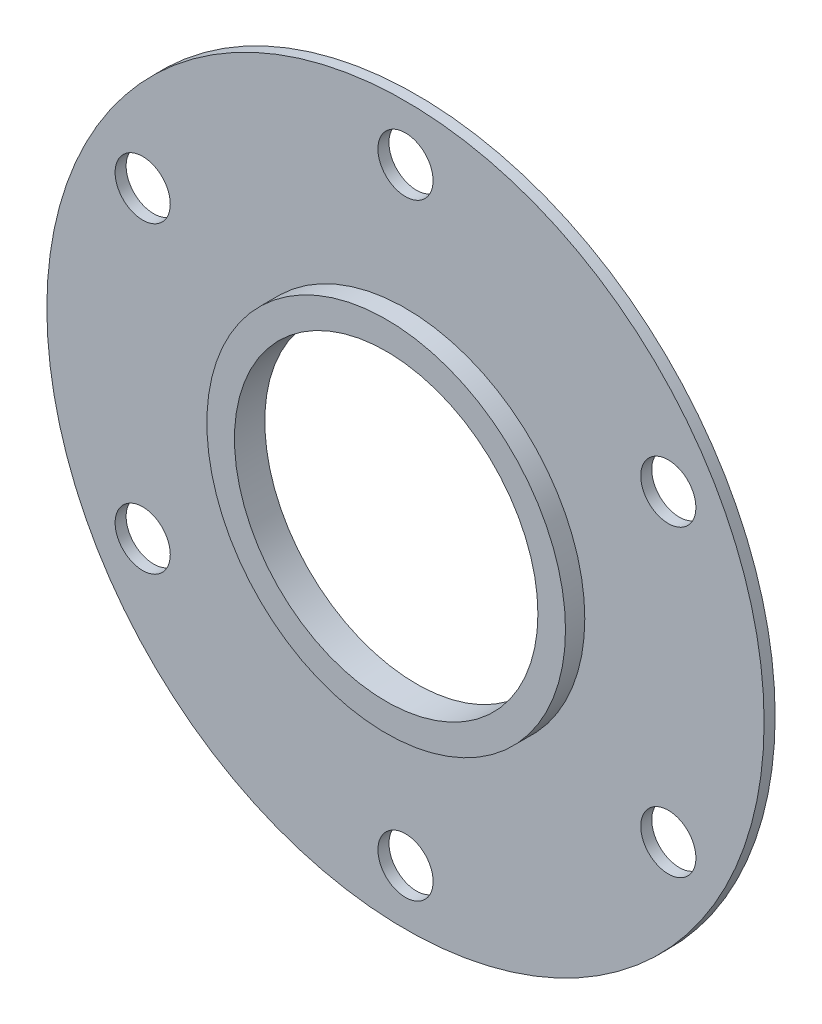
ISO-10303-21;
HEADER;
FILE_DESCRIPTION(('STEP AP214'),'2;1');
FILE_NAME('part.step','',(''),(''),'','','');
FILE_SCHEMA(('AUTOMOTIVE_DESIGN { 1 0 10303 214 1 1 1 1 }'));
ENDSEC;
DATA;
#1=APPLICATION_CONTEXT('core data for automotive mechanical design processes');
#2=APPLICATION_PROTOCOL_DEFINITION('international standard','automotive_design',2000,#1);
#3=PRODUCT_CONTEXT('',#1,'mechanical');
#4=PRODUCT('Part','Part','',(#3));
#5=PRODUCT_RELATED_PRODUCT_CATEGORY('part','',(#4));
#6=PRODUCT_DEFINITION_FORMATION('','',#4);
#7=PRODUCT_DEFINITION_CONTEXT('part definition',#1,'design');
#8=PRODUCT_DEFINITION('design','',#6,#7);
#9=PRODUCT_DEFINITION_SHAPE('','',#8);
#10=(LENGTH_UNIT() NAMED_UNIT(*) SI_UNIT(.MILLI.,.METRE.));
#11=(NAMED_UNIT(*) PLANE_ANGLE_UNIT() SI_UNIT($,.RADIAN.));
#12=(NAMED_UNIT(*) SI_UNIT($,.STERADIAN.) SOLID_ANGLE_UNIT());
#13=UNCERTAINTY_MEASURE_WITH_UNIT(LENGTH_MEASURE(1.E-05),#10,'distance_accuracy_value','');
#14=(GEOMETRIC_REPRESENTATION_CONTEXT(3) GLOBAL_UNCERTAINTY_ASSIGNED_CONTEXT((#13)) GLOBAL_UNIT_ASSIGNED_CONTEXT((#10,
#11,#12)) REPRESENTATION_CONTEXT('',''));
#15=CARTESIAN_POINT('',(0.,0.,0.));
#16=DIRECTION('',(0.,0.,1.));
#17=DIRECTION('',(1.,0.,0.));
#18=AXIS2_PLACEMENT_3D('',#15,#16,#17);
#19=CARTESIAN_POINT('',(0.,0.,0.8));
#20=DIRECTION('',(0.,0.,1.));
#21=DIRECTION('',(1.,0.,0.));
#22=AXIS2_PLACEMENT_3D('',#19,#20,#21);
#23=PLANE('',#22);
#24=CARTESIAN_POINT('',(-19.0520588832566,10.9991339745948,0.8));
#25=DIRECTION('',(0.,0.,1.));
#26=DIRECTION('',(1.,0.,0.));
#27=AXIS2_PLACEMENT_3D('',#24,#25,#26);
#28=CIRCLE('',#27,2.);
#29=CARTESIAN_POINT('',(-17.0520588832566,10.9991339745948,0.8));
#30=VERTEX_POINT('',#29);
#31=EDGE_CURVE('E76',#30,#30,#28,.T.);
#32=ORIENTED_EDGE('',*,*,#31,.F.);
#33=EDGE_LOOP('',(#32));
#34=FACE_BOUND('',#33,.T.);
#35=CARTESIAN_POINT('',(0.00200000000360557,-22.,0.8));
#36=DIRECTION('',(0.,0.,1.));
#37=DIRECTION('',(1.,0.,0.));
#38=AXIS2_PLACEMENT_3D('',#35,#36,#37);
#39=CIRCLE('',#38,2.);
#40=CARTESIAN_POINT('',(2.00200000000361,-22.,0.8));
#41=VERTEX_POINT('',#40);
#42=EDGE_CURVE('E64',#41,#41,#39,.T.);
#43=ORIENTED_EDGE('',*,*,#42,.F.);
#44=EDGE_LOOP('',(#43));
#45=FACE_BOUND('',#44,.T.);
#46=CARTESIAN_POINT('',(19.0530588832586,11.0008660254054,0.8));
#47=DIRECTION('',(0.,0.,1.));
#48=DIRECTION('',(1.,0.,0.));
#49=AXIS2_PLACEMENT_3D('',#46,#47,#48);
#50=CIRCLE('',#49,2.);
#51=CARTESIAN_POINT('',(21.0530588832586,11.0008660254054,0.8));
#52=VERTEX_POINT('',#51);
#53=EDGE_CURVE('E52',#52,#52,#50,.T.);
#54=ORIENTED_EDGE('',*,*,#53,.F.);
#55=EDGE_LOOP('',(#54));
#56=FACE_BOUND('',#55,.T.);
#57=CARTESIAN_POINT('',(0.,0.,0.8));
#58=DIRECTION('',(0.,0.,1.));
#59=DIRECTION('',(1.,0.,0.));
#60=AXIS2_PLACEMENT_3D('',#57,#58,#59);
#61=CIRCLE('',#60,26.);
#62=CARTESIAN_POINT('',(26.,0.,0.8));
#63=VERTEX_POINT('',#62);
#64=EDGE_CURVE('E10',#63,#63,#61,.T.);
#65=ORIENTED_EDGE('',*,*,#64,.T.);
#66=EDGE_LOOP('',(#65));
#67=FACE_BOUND('',#66,.T.);
#68=CARTESIAN_POINT('',(0.,22.,0.8));
#69=DIRECTION('',(0.,0.,1.));
#70=DIRECTION('',(1.,0.,0.));
#71=AXIS2_PLACEMENT_3D('',#68,#69,#70);
#72=CIRCLE('',#71,2.);
#73=CARTESIAN_POINT('',(2.,22.,0.8));
#74=VERTEX_POINT('',#73);
#75=EDGE_CURVE('E48',#74,#74,#72,.T.);
#76=ORIENTED_EDGE('',*,*,#75,.F.);
#77=EDGE_LOOP('',(#76));
#78=FACE_BOUND('',#77,.T.);
#79=CARTESIAN_POINT('',(19.0540588832604,-10.9991339745947,0.8));
#80=DIRECTION('',(0.,0.,1.));
#81=DIRECTION('',(1.,0.,0.));
#82=AXIS2_PLACEMENT_3D('',#79,#80,#81);
#83=CIRCLE('',#82,2.);
#84=CARTESIAN_POINT('',(21.0540588832604,-10.9991339745947,0.8));
#85=VERTEX_POINT('',#84);
#86=EDGE_CURVE('E58',#85,#85,#83,.T.);
#87=ORIENTED_EDGE('',*,*,#86,.F.);
#88=EDGE_LOOP('',(#87));
#89=FACE_BOUND('',#88,.T.);
#90=CARTESIAN_POINT('',(-19.0510588832549,-11.0008660254052,0.8));
#91=DIRECTION('',(0.,0.,1.));
#92=DIRECTION('',(1.,0.,0.));
#93=AXIS2_PLACEMENT_3D('',#90,#91,#92);
#94=CIRCLE('',#93,2.);
#95=CARTESIAN_POINT('',(-17.0510588832549,-11.0008660254052,0.8));
#96=VERTEX_POINT('',#95);
#97=EDGE_CURVE('E70',#96,#96,#94,.T.);
#98=ORIENTED_EDGE('',*,*,#97,.F.);
#99=EDGE_LOOP('',(#98));
#100=FACE_BOUND('',#99,.T.);
#101=CARTESIAN_POINT('',(0.,0.,0.8));
#102=DIRECTION('',(0.,0.,1.));
#103=DIRECTION('',(1.,0.,0.));
#104=AXIS2_PLACEMENT_3D('',#101,#102,#103);
#105=CIRCLE('',#104,13.);
#106=CARTESIAN_POINT('',(13.,0.,0.8));
#107=VERTEX_POINT('',#106);
#108=EDGE_CURVE('E85',#107,#107,#105,.T.);
#109=ORIENTED_EDGE('',*,*,#108,.F.);
#110=EDGE_LOOP('',(#109));
#111=FACE_BOUND('',#110,.T.);
#112=ADVANCED_FACE('F33',(#34,#45,#56,#67,#78,#89,#100,#111),#23,.T.);
#113=CARTESIAN_POINT('',(0.,0.,0.));
#114=DIRECTION('',(0.,0.,1.));
#115=DIRECTION('',(1.,0.,0.));
#116=AXIS2_PLACEMENT_3D('',#113,#114,#115);
#117=PLANE('',#116);
#118=CARTESIAN_POINT('',(0.,0.,0.));
#119=DIRECTION('',(0.,0.,1.));
#120=DIRECTION('',(1.,0.,0.));
#121=AXIS2_PLACEMENT_3D('',#118,#119,#120);
#122=CIRCLE('',#121,26.);
#123=CARTESIAN_POINT('',(26.,0.,0.));
#124=VERTEX_POINT('',#123);
#125=EDGE_CURVE('E37',#124,#124,#122,.T.);
#126=ORIENTED_EDGE('',*,*,#125,.F.);
#127=EDGE_LOOP('',(#126));
#128=FACE_BOUND('',#127,.T.);
#129=CARTESIAN_POINT('',(0.,0.,0.));
#130=DIRECTION('',(0.,0.,1.));
#131=DIRECTION('',(1.,0.,0.));
#132=AXIS2_PLACEMENT_3D('',#129,#130,#131);
#133=CIRCLE('',#132,11.);
#134=CARTESIAN_POINT('',(11.,0.,0.));
#135=VERTEX_POINT('',#134);
#136=EDGE_CURVE('E44',#135,#135,#133,.T.);
#137=ORIENTED_EDGE('',*,*,#136,.T.);
#138=EDGE_LOOP('',(#137));
#139=FACE_BOUND('',#138,.T.);
#140=CARTESIAN_POINT('',(0.,22.,0.));
#141=DIRECTION('',(0.,0.,1.));
#142=DIRECTION('',(1.,0.,0.));
#143=AXIS2_PLACEMENT_3D('',#140,#141,#142);
#144=CIRCLE('',#143,2.);
#145=CARTESIAN_POINT('',(2.,22.,0.));
#146=VERTEX_POINT('',#145);
#147=EDGE_CURVE('E49',#146,#146,#144,.T.);
#148=ORIENTED_EDGE('',*,*,#147,.T.);
#149=EDGE_LOOP('',(#148));
#150=FACE_BOUND('',#149,.T.);
#151=CARTESIAN_POINT('',(19.0530588832586,11.0008660254054,0.));
#152=DIRECTION('',(0.,0.,1.));
#153=DIRECTION('',(1.,0.,0.));
#154=AXIS2_PLACEMENT_3D('',#151,#152,#153);
#155=CIRCLE('',#154,2.);
#156=CARTESIAN_POINT('',(21.0530588832586,11.0008660254054,0.));
#157=VERTEX_POINT('',#156);
#158=EDGE_CURVE('E55',#157,#157,#155,.T.);
#159=ORIENTED_EDGE('',*,*,#158,.T.);
#160=EDGE_LOOP('',(#159));
#161=FACE_BOUND('',#160,.T.);
#162=CARTESIAN_POINT('',(19.0540588832604,-10.9991339745947,0.));
#163=DIRECTION('',(0.,0.,1.));
#164=DIRECTION('',(1.,0.,0.));
#165=AXIS2_PLACEMENT_3D('',#162,#163,#164);
#166=CIRCLE('',#165,2.);
#167=CARTESIAN_POINT('',(21.0540588832604,-10.9991339745947,0.));
#168=VERTEX_POINT('',#167);
#169=EDGE_CURVE('E61',#168,#168,#166,.T.);
#170=ORIENTED_EDGE('',*,*,#169,.T.);
#171=EDGE_LOOP('',(#170));
#172=FACE_BOUND('',#171,.T.);
#173=CARTESIAN_POINT('',(0.00200000000360557,-22.,0.));
#174=DIRECTION('',(0.,0.,1.));
#175=DIRECTION('',(1.,0.,0.));
#176=AXIS2_PLACEMENT_3D('',#173,#174,#175);
#177=CIRCLE('',#176,2.);
#178=CARTESIAN_POINT('',(2.00200000000361,-22.,0.));
#179=VERTEX_POINT('',#178);
#180=EDGE_CURVE('E67',#179,#179,#177,.T.);
#181=ORIENTED_EDGE('',*,*,#180,.T.);
#182=EDGE_LOOP('',(#181));
#183=FACE_BOUND('',#182,.T.);
#184=CARTESIAN_POINT('',(-19.0510588832549,-11.0008660254052,0.));
#185=DIRECTION('',(0.,0.,1.));
#186=DIRECTION('',(1.,0.,0.));
#187=AXIS2_PLACEMENT_3D('',#184,#185,#186);
#188=CIRCLE('',#187,2.);
#189=CARTESIAN_POINT('',(-17.0510588832549,-11.0008660254052,0.));
#190=VERTEX_POINT('',#189);
#191=EDGE_CURVE('E73',#190,#190,#188,.T.);
#192=ORIENTED_EDGE('',*,*,#191,.T.);
#193=EDGE_LOOP('',(#192));
#194=FACE_BOUND('',#193,.T.);
#195=CARTESIAN_POINT('',(-19.0520588832566,10.9991339745948,0.));
#196=DIRECTION('',(0.,0.,1.));
#197=DIRECTION('',(1.,0.,0.));
#198=AXIS2_PLACEMENT_3D('',#195,#196,#197);
#199=CIRCLE('',#198,2.);
#200=CARTESIAN_POINT('',(-17.0520588832566,10.9991339745948,0.));
#201=VERTEX_POINT('',#200);
#202=EDGE_CURVE('E79',#201,#201,#199,.T.);
#203=ORIENTED_EDGE('',*,*,#202,.T.);
#204=EDGE_LOOP('',(#203));
#205=FACE_BOUND('',#204,.T.);
#206=ADVANCED_FACE('F112',(#128,#139,#150,#161,#172,#183,#194,#205),#117,.F.);
#207=CARTESIAN_POINT('',(0.,0.,0.8));
#208=DIRECTION('',(0.,0.,-1.));
#209=DIRECTION('',(-1.,0.,0.));
#210=AXIS2_PLACEMENT_3D('',#207,#208,#209);
#211=CYLINDRICAL_SURFACE('',#210,26.);
#212=ORIENTED_EDGE('',*,*,#64,.F.);
#213=EDGE_LOOP('',(#212));
#214=FACE_BOUND('',#213,.T.);
#215=ORIENTED_EDGE('',*,*,#125,.T.);
#216=EDGE_LOOP('',(#215));
#217=FACE_BOUND('',#216,.T.);
#218=ADVANCED_FACE('F35',(#214,#217),#211,.T.);
#219=CARTESIAN_POINT('',(0.,0.,0.8));
#220=DIRECTION('',(0.,0.,-1.));
#221=DIRECTION('',(-1.,0.,0.));
#222=AXIS2_PLACEMENT_3D('',#219,#220,#221);
#223=CYLINDRICAL_SURFACE('',#222,11.);
#224=ORIENTED_EDGE('',*,*,#136,.F.);
#225=EDGE_LOOP('',(#224));
#226=FACE_BOUND('',#225,.T.);
#227=CARTESIAN_POINT('',(0.,0.,2.2));
#228=DIRECTION('',(0.,0.,1.));
#229=DIRECTION('',(1.,0.,0.));
#230=AXIS2_PLACEMENT_3D('',#227,#228,#229);
#231=CIRCLE('',#230,11.);
#232=CARTESIAN_POINT('',(11.,0.,2.2));
#233=VERTEX_POINT('',#232);
#234=EDGE_CURVE('E88',#233,#233,#231,.T.);
#235=ORIENTED_EDGE('',*,*,#234,.T.);
#236=EDGE_LOOP('',(#235));
#237=FACE_BOUND('',#236,.T.);
#238=ADVANCED_FACE('F94',(#226,#237),#223,.F.);
#239=CARTESIAN_POINT('',(0.,22.,0.8));
#240=DIRECTION('',(0.,0.,-1.));
#241=DIRECTION('',(-1.,0.,0.));
#242=AXIS2_PLACEMENT_3D('',#239,#240,#241);
#243=CYLINDRICAL_SURFACE('',#242,2.);
#244=ORIENTED_EDGE('',*,*,#75,.T.);
#245=EDGE_LOOP('',(#244));
#246=FACE_BOUND('',#245,.T.);
#247=ORIENTED_EDGE('',*,*,#147,.F.);
#248=EDGE_LOOP('',(#247));
#249=FACE_BOUND('',#248,.T.);
#250=ADVANCED_FACE('F124',(#246,#249),#243,.F.);
#251=CARTESIAN_POINT('',(19.0530588832586,11.0008660254054,0.8));
#252=DIRECTION('',(0.,0.,-1.));
#253=DIRECTION('',(-1.,0.,0.));
#254=AXIS2_PLACEMENT_3D('',#251,#252,#253);
#255=CYLINDRICAL_SURFACE('',#254,2.);
#256=ORIENTED_EDGE('',*,*,#53,.T.);
#257=EDGE_LOOP('',(#256));
#258=FACE_BOUND('',#257,.T.);
#259=ORIENTED_EDGE('',*,*,#158,.F.);
#260=EDGE_LOOP('',(#259));
#261=FACE_BOUND('',#260,.T.);
#262=ADVANCED_FACE('F128',(#258,#261),#255,.F.);
#263=CARTESIAN_POINT('',(19.0540588832604,-10.9991339745947,0.8));
#264=DIRECTION('',(0.,0.,-1.));
#265=DIRECTION('',(-1.,0.,0.));
#266=AXIS2_PLACEMENT_3D('',#263,#264,#265);
#267=CYLINDRICAL_SURFACE('',#266,2.);
#268=ORIENTED_EDGE('',*,*,#86,.T.);
#269=EDGE_LOOP('',(#268));
#270=FACE_BOUND('',#269,.T.);
#271=ORIENTED_EDGE('',*,*,#169,.F.);
#272=EDGE_LOOP('',(#271));
#273=FACE_BOUND('',#272,.T.);
#274=ADVANCED_FACE('F132',(#270,#273),#267,.F.);
#275=CARTESIAN_POINT('',(0.00200000000360557,-22.,0.8));
#276=DIRECTION('',(0.,0.,-1.));
#277=DIRECTION('',(-1.,0.,0.));
#278=AXIS2_PLACEMENT_3D('',#275,#276,#277);
#279=CYLINDRICAL_SURFACE('',#278,2.);
#280=ORIENTED_EDGE('',*,*,#42,.T.);
#281=EDGE_LOOP('',(#280));
#282=FACE_BOUND('',#281,.T.);
#283=ORIENTED_EDGE('',*,*,#180,.F.);
#284=EDGE_LOOP('',(#283));
#285=FACE_BOUND('',#284,.T.);
#286=ADVANCED_FACE('F136',(#282,#285),#279,.F.);
#287=CARTESIAN_POINT('',(-19.0510588832549,-11.0008660254052,0.8));
#288=DIRECTION('',(0.,0.,-1.));
#289=DIRECTION('',(-1.,0.,0.));
#290=AXIS2_PLACEMENT_3D('',#287,#288,#289);
#291=CYLINDRICAL_SURFACE('',#290,2.);
#292=ORIENTED_EDGE('',*,*,#97,.T.);
#293=EDGE_LOOP('',(#292));
#294=FACE_BOUND('',#293,.T.);
#295=ORIENTED_EDGE('',*,*,#191,.F.);
#296=EDGE_LOOP('',(#295));
#297=FACE_BOUND('',#296,.T.);
#298=ADVANCED_FACE('F108',(#294,#297),#291,.F.);
#299=CARTESIAN_POINT('',(-19.0520588832566,10.9991339745948,0.8));
#300=DIRECTION('',(0.,0.,-1.));
#301=DIRECTION('',(-1.,0.,0.));
#302=AXIS2_PLACEMENT_3D('',#299,#300,#301);
#303=CYLINDRICAL_SURFACE('',#302,2.);
#304=ORIENTED_EDGE('',*,*,#31,.T.);
#305=EDGE_LOOP('',(#304));
#306=FACE_BOUND('',#305,.T.);
#307=ORIENTED_EDGE('',*,*,#202,.F.);
#308=EDGE_LOOP('',(#307));
#309=FACE_BOUND('',#308,.T.);
#310=ADVANCED_FACE('F99',(#306,#309),#303,.F.);
#311=CARTESIAN_POINT('',(0.,0.,2.2));
#312=DIRECTION('',(0.,0.,1.));
#313=DIRECTION('',(1.,0.,0.));
#314=AXIS2_PLACEMENT_3D('',#311,#312,#313);
#315=PLANE('',#314);
#316=CARTESIAN_POINT('',(0.,0.,2.2));
#317=DIRECTION('',(0.,0.,1.));
#318=DIRECTION('',(1.,0.,0.));
#319=AXIS2_PLACEMENT_3D('',#316,#317,#318);
#320=CIRCLE('',#319,13.);
#321=CARTESIAN_POINT('',(13.,0.,2.2));
#322=VERTEX_POINT('',#321);
#323=EDGE_CURVE('E82',#322,#322,#320,.T.);
#324=ORIENTED_EDGE('',*,*,#323,.T.);
#325=EDGE_LOOP('',(#324));
#326=FACE_BOUND('',#325,.T.);
#327=ORIENTED_EDGE('',*,*,#234,.F.);
#328=EDGE_LOOP('',(#327));
#329=FACE_BOUND('',#328,.T.);
#330=ADVANCED_FACE('F96',(#326,#329),#315,.T.);
#331=CARTESIAN_POINT('',(0.,0.,2.2));
#332=DIRECTION('',(0.,0.,-1.));
#333=DIRECTION('',(-1.,0.,0.));
#334=AXIS2_PLACEMENT_3D('',#331,#332,#333);
#335=CYLINDRICAL_SURFACE('',#334,13.);
#336=ORIENTED_EDGE('',*,*,#323,.F.);
#337=EDGE_LOOP('',(#336));
#338=FACE_BOUND('',#337,.T.);
#339=ORIENTED_EDGE('',*,*,#108,.T.);
#340=EDGE_LOOP('',(#339));
#341=FACE_BOUND('',#340,.T.);
#342=ADVANCED_FACE('F98',(#338,#341),#335,.T.);
#343=CLOSED_SHELL('',(#112,#206,#218,#238,#250,#262,#274,#286,#298,#310,#330,#342));
#344=MANIFOLD_SOLID_BREP('B2',#343);
#345=ADVANCED_BREP_SHAPE_REPRESENTATION('',(#18,#344),#14);
#346=SHAPE_DEFINITION_REPRESENTATION(#9,#345);
ENDSEC;
END-ISO-10303-21;
